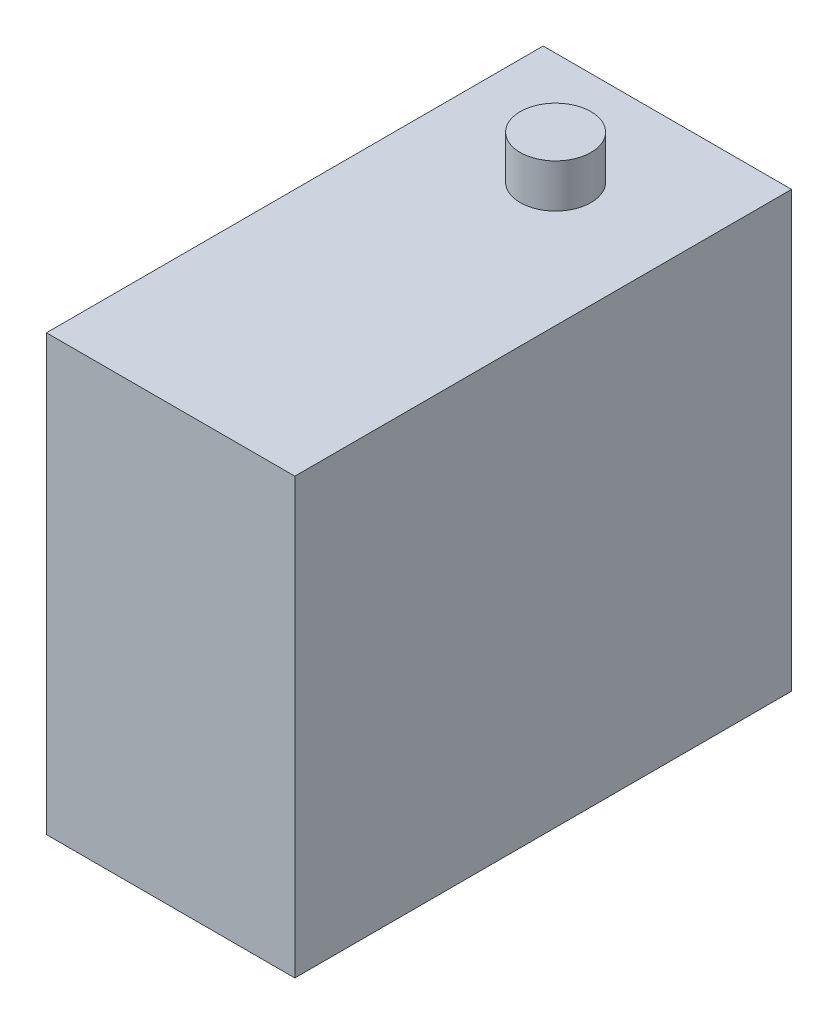
ISO-10303-21;
HEADER;
FILE_DESCRIPTION(('STEP AP214'),'2;1');
FILE_NAME('part.step','',(''),(''),'','','');
FILE_SCHEMA(('AUTOMOTIVE_DESIGN { 1 0 10303 214 1 1 1 1 }'));
ENDSEC;
DATA;
#1=APPLICATION_CONTEXT('core data for automotive mechanical design processes');
#2=APPLICATION_PROTOCOL_DEFINITION('international standard','automotive_design',2000,#1);
#3=PRODUCT_CONTEXT('',#1,'mechanical');
#4=PRODUCT('Part','Part','',(#3));
#5=PRODUCT_RELATED_PRODUCT_CATEGORY('part','',(#4));
#6=PRODUCT_DEFINITION_FORMATION('','',#4);
#7=PRODUCT_DEFINITION_CONTEXT('part definition',#1,'design');
#8=PRODUCT_DEFINITION('design','',#6,#7);
#9=PRODUCT_DEFINITION_SHAPE('','',#8);
#10=(LENGTH_UNIT() NAMED_UNIT(*) SI_UNIT(.MILLI.,.METRE.));
#11=(NAMED_UNIT(*) PLANE_ANGLE_UNIT() SI_UNIT($,.RADIAN.));
#12=(NAMED_UNIT(*) SI_UNIT($,.STERADIAN.) SOLID_ANGLE_UNIT());
#13=UNCERTAINTY_MEASURE_WITH_UNIT(LENGTH_MEASURE(1.E-05),#10,'distance_accuracy_value','');
#14=(GEOMETRIC_REPRESENTATION_CONTEXT(3) GLOBAL_UNCERTAINTY_ASSIGNED_CONTEXT((#13)) GLOBAL_UNIT_ASSIGNED_CONTEXT((#10,
#11,#12)) REPRESENTATION_CONTEXT('',''));
#15=CARTESIAN_POINT('',(0.,0.,0.));
#16=DIRECTION('',(0.,0.,1.));
#17=DIRECTION('',(1.,0.,0.));
#18=AXIS2_PLACEMENT_3D('',#15,#16,#17);
#19=CARTESIAN_POINT('',(10.,35.,-20.));
#20=DIRECTION('',(-1.,0.,0.));
#21=DIRECTION('',(0.,0.,1.));
#22=AXIS2_PLACEMENT_3D('',#19,#20,#21);
#23=PLANE('',#22);
#24=DIRECTION('',(0.,0.,-1.));
#25=VECTOR('',#24,1.);
#26=CARTESIAN_POINT('',(10.,0.,-20.));
#27=LINE('',#26,#25);
#28=CARTESIAN_POINT('',(10.,0.,20.));
#29=VERTEX_POINT('',#28);
#30=CARTESIAN_POINT('',(10.,0.,-20.));
#31=VERTEX_POINT('',#30);
#32=EDGE_CURVE('E107',#29,#31,#27,.T.);
#33=ORIENTED_EDGE('',*,*,#32,.T.);
#34=DIRECTION('',(0.,-1.,0.));
#35=VECTOR('',#34,1.);
#36=CARTESIAN_POINT('',(10.,35.,-20.));
#37=LINE('',#36,#35);
#38=CARTESIAN_POINT('',(10.,35.,-20.));
#39=VERTEX_POINT('',#38);
#40=EDGE_CURVE('E11',#39,#31,#37,.T.);
#41=ORIENTED_EDGE('',*,*,#40,.F.);
#42=DIRECTION('',(0.,0.,-1.));
#43=VECTOR('',#42,1.);
#44=CARTESIAN_POINT('',(10.,35.,-20.));
#45=LINE('',#44,#43);
#46=CARTESIAN_POINT('',(10.,35.,20.));
#47=VERTEX_POINT('',#46);
#48=EDGE_CURVE('E91',#47,#39,#45,.T.);
#49=ORIENTED_EDGE('',*,*,#48,.F.);
#50=DIRECTION('',(0.,-1.,0.));
#51=VECTOR('',#50,1.);
#52=CARTESIAN_POINT('',(10.,35.,20.));
#53=LINE('',#52,#51);
#54=EDGE_CURVE('E103',#47,#29,#53,.T.);
#55=ORIENTED_EDGE('',*,*,#54,.T.);
#56=EDGE_LOOP('',(#33,#41,#49,#55));
#57=FACE_BOUND('',#56,.T.);
#58=ADVANCED_FACE('F39',(#57),#23,.F.);
#59=CARTESIAN_POINT('',(-10.,35.,-20.));
#60=DIRECTION('',(0.,0.,1.));
#61=DIRECTION('',(1.,0.,0.));
#62=AXIS2_PLACEMENT_3D('',#59,#60,#61);
#63=PLANE('',#62);
#64=DIRECTION('',(-1.,0.,0.));
#65=VECTOR('',#64,1.);
#66=CARTESIAN_POINT('',(-10.,0.,-20.));
#67=LINE('',#66,#65);
#68=CARTESIAN_POINT('',(-10.,0.,-20.));
#69=VERTEX_POINT('',#68);
#70=EDGE_CURVE('E96',#31,#69,#67,.T.);
#71=ORIENTED_EDGE('',*,*,#70,.T.);
#72=DIRECTION('',(0.,-1.,0.));
#73=VECTOR('',#72,1.);
#74=CARTESIAN_POINT('',(-10.,35.,-20.));
#75=LINE('',#74,#73);
#76=CARTESIAN_POINT('',(-10.,35.,-20.));
#77=VERTEX_POINT('',#76);
#78=EDGE_CURVE('E48',#77,#69,#75,.T.);
#79=ORIENTED_EDGE('',*,*,#78,.F.);
#80=DIRECTION('',(-1.,0.,0.));
#81=VECTOR('',#80,1.);
#82=CARTESIAN_POINT('',(-10.,35.,-20.));
#83=LINE('',#82,#81);
#84=EDGE_CURVE('E86',#39,#77,#83,.T.);
#85=ORIENTED_EDGE('',*,*,#84,.F.);
#86=ORIENTED_EDGE('',*,*,#40,.T.);
#87=EDGE_LOOP('',(#71,#79,#85,#86));
#88=FACE_BOUND('',#87,.T.);
#89=ADVANCED_FACE('F95',(#88),#63,.F.);
#90=CARTESIAN_POINT('',(-10.,35.,-20.));
#91=DIRECTION('',(1.,0.,0.));
#92=DIRECTION('',(0.,0.,-1.));
#93=AXIS2_PLACEMENT_3D('',#90,#91,#92);
#94=PLANE('',#93);
#95=DIRECTION('',(0.,0.,1.));
#96=VECTOR('',#95,1.);
#97=CARTESIAN_POINT('',(-10.,0.,-20.));
#98=LINE('',#97,#96);
#99=CARTESIAN_POINT('',(-10.,0.,20.));
#100=VERTEX_POINT('',#99);
#101=EDGE_CURVE('E73',#69,#100,#98,.T.);
#102=ORIENTED_EDGE('',*,*,#101,.T.);
#103=DIRECTION('',(0.,-1.,0.));
#104=VECTOR('',#103,1.);
#105=CARTESIAN_POINT('',(-10.,35.,20.));
#106=LINE('',#105,#104);
#107=CARTESIAN_POINT('',(-10.,35.,20.));
#108=VERTEX_POINT('',#107);
#109=EDGE_CURVE('E98',#108,#100,#106,.T.);
#110=ORIENTED_EDGE('',*,*,#109,.F.);
#111=DIRECTION('',(0.,0.,1.));
#112=VECTOR('',#111,1.);
#113=CARTESIAN_POINT('',(-10.,35.,-20.));
#114=LINE('',#113,#112);
#115=EDGE_CURVE('E89',#77,#108,#114,.T.);
#116=ORIENTED_EDGE('',*,*,#115,.F.);
#117=ORIENTED_EDGE('',*,*,#78,.T.);
#118=EDGE_LOOP('',(#102,#110,#116,#117));
#119=FACE_BOUND('',#118,.T.);
#120=ADVANCED_FACE('F99',(#119),#94,.F.);
#121=CARTESIAN_POINT('',(-10.,35.,20.));
#122=DIRECTION('',(0.,0.,-1.));
#123=DIRECTION('',(-1.,0.,0.));
#124=AXIS2_PLACEMENT_3D('',#121,#122,#123);
#125=PLANE('',#124);
#126=DIRECTION('',(1.,0.,0.));
#127=VECTOR('',#126,1.);
#128=CARTESIAN_POINT('',(-10.,0.,20.));
#129=LINE('',#128,#127);
#130=EDGE_CURVE('E79',#100,#29,#129,.T.);
#131=ORIENTED_EDGE('',*,*,#130,.T.);
#132=ORIENTED_EDGE('',*,*,#54,.F.);
#133=DIRECTION('',(1.,0.,0.));
#134=VECTOR('',#133,1.);
#135=CARTESIAN_POINT('',(-10.,35.,20.));
#136=LINE('',#135,#134);
#137=EDGE_CURVE('E56',#108,#47,#136,.T.);
#138=ORIENTED_EDGE('',*,*,#137,.F.);
#139=ORIENTED_EDGE('',*,*,#109,.T.);
#140=EDGE_LOOP('',(#131,#132,#138,#139));
#141=FACE_BOUND('',#140,.T.);
#142=ADVANCED_FACE('F121',(#141),#125,.F.);
#143=CARTESIAN_POINT('',(0.,35.,0.));
#144=DIRECTION('',(0.,1.,0.));
#145=DIRECTION('',(0.,0.,1.));
#146=AXIS2_PLACEMENT_3D('',#143,#144,#145);
#147=PLANE('',#146);
#148=CARTESIAN_POINT('',(0.,35.,-11.));
#149=DIRECTION('',(0.,1.,0.));
#150=DIRECTION('',(0.,0.,1.));
#151=AXIS2_PLACEMENT_3D('',#148,#149,#150);
#152=CIRCLE('',#151,2.85);
#153=CARTESIAN_POINT('',(0.,35.,-13.85));
#154=VERTEX_POINT('',#153);
#155=EDGE_CURVE('E128',#154,#154,#152,.T.);
#156=ORIENTED_EDGE('',*,*,#155,.F.);
#157=EDGE_LOOP('',(#156));
#158=FACE_BOUND('',#157,.T.);
#159=ORIENTED_EDGE('',*,*,#48,.T.);
#160=ORIENTED_EDGE('',*,*,#84,.T.);
#161=ORIENTED_EDGE('',*,*,#115,.T.);
#162=ORIENTED_EDGE('',*,*,#137,.T.);
#163=EDGE_LOOP('',(#159,#160,#161,#162));
#164=FACE_BOUND('',#163,.T.);
#165=ADVANCED_FACE('F87',(#158,#164),#147,.T.);
#166=CARTESIAN_POINT('',(0.,0.,0.));
#167=DIRECTION('',(0.,1.,0.));
#168=DIRECTION('',(0.,0.,1.));
#169=AXIS2_PLACEMENT_3D('',#166,#167,#168);
#170=PLANE('',#169);
#171=ORIENTED_EDGE('',*,*,#32,.F.);
#172=ORIENTED_EDGE('',*,*,#130,.F.);
#173=ORIENTED_EDGE('',*,*,#101,.F.);
#174=ORIENTED_EDGE('',*,*,#70,.F.);
#175=EDGE_LOOP('',(#171,#172,#173,#174));
#176=FACE_BOUND('',#175,.T.);
#177=ADVANCED_FACE('F124',(#176),#170,.F.);
#178=CARTESIAN_POINT('',(0.,38.5,-11.));
#179=DIRECTION('',(0.,-1.,0.));
#180=DIRECTION('',(0.,0.,-1.));
#181=AXIS2_PLACEMENT_3D('',#178,#179,#180);
#182=CYLINDRICAL_SURFACE('',#181,2.85);
#183=CARTESIAN_POINT('',(0.,38.5,-11.));
#184=DIRECTION('',(0.,1.,0.));
#185=DIRECTION('',(0.,0.,1.));
#186=AXIS2_PLACEMENT_3D('',#183,#184,#185);
#187=CIRCLE('',#186,2.85);
#188=CARTESIAN_POINT('',(0.,38.5,-13.85));
#189=VERTEX_POINT('',#188);
#190=EDGE_CURVE('E111',#189,#189,#187,.T.);
#191=CARTESIAN_POINT('',(0.,38.5,-13.85));
#192=CARTESIAN_POINT('',(0.,38.4635416666667,-13.85));
#193=CARTESIAN_POINT('',(0.,38.4270833333333,-13.85));
#194=CARTESIAN_POINT('',(0.,38.3541666666667,-13.85));
#195=CARTESIAN_POINT('',(0.,38.3177083333333,-13.85));
#196=CARTESIAN_POINT('',(0.,38.2447916666667,-13.85));
#197=CARTESIAN_POINT('',(0.,38.2083333333333,-13.85));
#198=CARTESIAN_POINT('',(0.,38.1354166666667,-13.85));
#199=CARTESIAN_POINT('',(0.,38.0989583333333,-13.85));
#200=CARTESIAN_POINT('',(0.,38.0260416666667,-13.85));
#201=CARTESIAN_POINT('',(0.,37.9895833333333,-13.85));
#202=CARTESIAN_POINT('',(0.,37.9166666666667,-13.85));
#203=CARTESIAN_POINT('',(0.,37.8802083333333,-13.85));
#204=CARTESIAN_POINT('',(0.,37.8072916666667,-13.85));
#205=CARTESIAN_POINT('',(0.,37.7708333333333,-13.85));
#206=CARTESIAN_POINT('',(0.,37.6979166666667,-13.85));
#207=CARTESIAN_POINT('',(0.,37.6614583333333,-13.85));
#208=CARTESIAN_POINT('',(0.,37.5885416666667,-13.85));
#209=CARTESIAN_POINT('',(0.,37.5520833333333,-13.85));
#210=CARTESIAN_POINT('',(0.,37.4791666666667,-13.85));
#211=CARTESIAN_POINT('',(0.,37.4427083333333,-13.85));
#212=CARTESIAN_POINT('',(0.,37.3697916666667,-13.85));
#213=CARTESIAN_POINT('',(0.,37.3333333333333,-13.85));
#214=CARTESIAN_POINT('',(0.,37.2604166666667,-13.85));
#215=CARTESIAN_POINT('',(0.,37.2239583333333,-13.85));
#216=CARTESIAN_POINT('',(0.,37.1510416666667,-13.85));
#217=CARTESIAN_POINT('',(0.,37.1145833333333,-13.85));
#218=CARTESIAN_POINT('',(0.,37.0416666666667,-13.85));
#219=CARTESIAN_POINT('',(0.,37.0052083333333,-13.85));
#220=CARTESIAN_POINT('',(0.,36.9322916666667,-13.85));
#221=CARTESIAN_POINT('',(0.,36.8958333333333,-13.85));
#222=CARTESIAN_POINT('',(0.,36.8229166666667,-13.85));
#223=CARTESIAN_POINT('',(0.,36.7864583333333,-13.85));
#224=CARTESIAN_POINT('',(0.,36.7135416666667,-13.85));
#225=CARTESIAN_POINT('',(0.,36.6770833333333,-13.85));
#226=CARTESIAN_POINT('',(0.,36.6041666666667,-13.85));
#227=CARTESIAN_POINT('',(0.,36.5677083333333,-13.85));
#228=CARTESIAN_POINT('',(0.,36.4947916666667,-13.85));
#229=CARTESIAN_POINT('',(0.,36.4583333333333,-13.85));
#230=CARTESIAN_POINT('',(0.,36.3854166666667,-13.85));
#231=CARTESIAN_POINT('',(0.,36.3489583333333,-13.85));
#232=CARTESIAN_POINT('',(0.,36.2760416666667,-13.85));
#233=CARTESIAN_POINT('',(0.,36.2395833333333,-13.85));
#234=CARTESIAN_POINT('',(0.,36.1666666666667,-13.85));
#235=CARTESIAN_POINT('',(0.,36.1302083333333,-13.85));
#236=CARTESIAN_POINT('',(0.,36.0572916666667,-13.85));
#237=CARTESIAN_POINT('',(0.,36.0208333333333,-13.85));
#238=CARTESIAN_POINT('',(0.,35.9479166666667,-13.85));
#239=CARTESIAN_POINT('',(0.,35.9114583333333,-13.85));
#240=CARTESIAN_POINT('',(0.,35.8385416666667,-13.85));
#241=CARTESIAN_POINT('',(0.,35.8020833333333,-13.85));
#242=CARTESIAN_POINT('',(0.,35.7291666666667,-13.85));
#243=CARTESIAN_POINT('',(0.,35.6927083333333,-13.85));
#244=CARTESIAN_POINT('',(0.,35.6197916666667,-13.85));
#245=CARTESIAN_POINT('',(0.,35.5833333333333,-13.85));
#246=CARTESIAN_POINT('',(0.,35.5104166666667,-13.85));
#247=CARTESIAN_POINT('',(0.,35.4739583333333,-13.85));
#248=CARTESIAN_POINT('',(0.,35.4010416666667,-13.85));
#249=CARTESIAN_POINT('',(0.,35.3645833333333,-13.85));
#250=CARTESIAN_POINT('',(0.,35.2916666666667,-13.85));
#251=CARTESIAN_POINT('',(0.,35.2552083333333,-13.85));
#252=CARTESIAN_POINT('',(0.,35.1822916666667,-13.85));
#253=CARTESIAN_POINT('',(0.,35.1458333333333,-13.85));
#254=CARTESIAN_POINT('',(0.,35.0729166666667,-13.85));
#255=CARTESIAN_POINT('',(0.,35.0364583333333,-13.85));
#256=CARTESIAN_POINT('',(0.,35.,-13.85));
#257=B_SPLINE_CURVE_WITH_KNOTS('',3,(#191,#192,#193,#194,#195,#196,#197,#198,#199,#200,#201,
#202,#203,#204,#205,#206,#207,#208,#209,#210,#211,#212,#213,#214,#215,#216,#217,#218,#219,#220,
#221,#222,#223,#224,#225,#226,#227,#228,#229,#230,#231,#232,#233,#234,#235,#236,#237,#238,#239,
#240,#241,#242,#243,#244,#245,#246,#247,#248,#249,#250,#251,#252,#253,#254,#255,#256),
.UNSPECIFIED.,.F.,.F.,(4,2,2,2,2,2,2,2,2,2,2,2,2,2,2,2,2,2,2,2,2,2,2,2,2,2,2,2,2,2,2,2,4),(0.,
0.109374999999995,0.218749999999997,0.328124999999999,0.4375,0.546874999999995,
0.656249999999997,0.765624999999999,0.875000000000001,0.984374999999996,1.09375,1.203125,1.3125,
1.421875,1.53125,1.640625,1.75,1.859375,1.96875,2.078125,2.1875,2.296875,2.40625,2.515625,2.625,
2.734375,2.84375,2.953125,3.0625,3.171875,3.28125,3.390625,3.5),.UNSPECIFIED.);
#258=EDGE_CURVE('BSEAM138',#189,#154,#257,.T.);
#259=ORIENTED_EDGE('',*,*,#190,.F.);
#260=ORIENTED_EDGE('',*,*,#155,.T.);
#261=ORIENTED_EDGE('',*,*,#258,.T.);
#262=ORIENTED_EDGE('',*,*,#258,.F.);
#263=EDGE_LOOP('',(#259,#261,#260,#262));
#264=FACE_BOUND('',#263,.T.);
#265=ADVANCED_FACE('F138',(#264),#182,.T.);
#266=CARTESIAN_POINT('',(0.,38.5,-11.));
#267=DIRECTION('',(0.,1.,0.));
#268=DIRECTION('',(0.,0.,1.));
#269=AXIS2_PLACEMENT_3D('',#266,#267,#268);
#270=PLANE('',#269);
#271=ORIENTED_EDGE('',*,*,#190,.T.);
#272=EDGE_LOOP('',(#271));
#273=FACE_BOUND('',#272,.T.);
#274=ADVANCED_FACE('F136',(#273),#270,.T.);
#275=CLOSED_SHELL('',(#58,#89,#120,#142,#165,#177,#265,#274));
#276=MANIFOLD_SOLID_BREP('B2',#275);
#277=ADVANCED_BREP_SHAPE_REPRESENTATION('',(#18,#276),#14);
#278=SHAPE_DEFINITION_REPRESENTATION(#9,#277);
ENDSEC;
END-ISO-10303-21;
